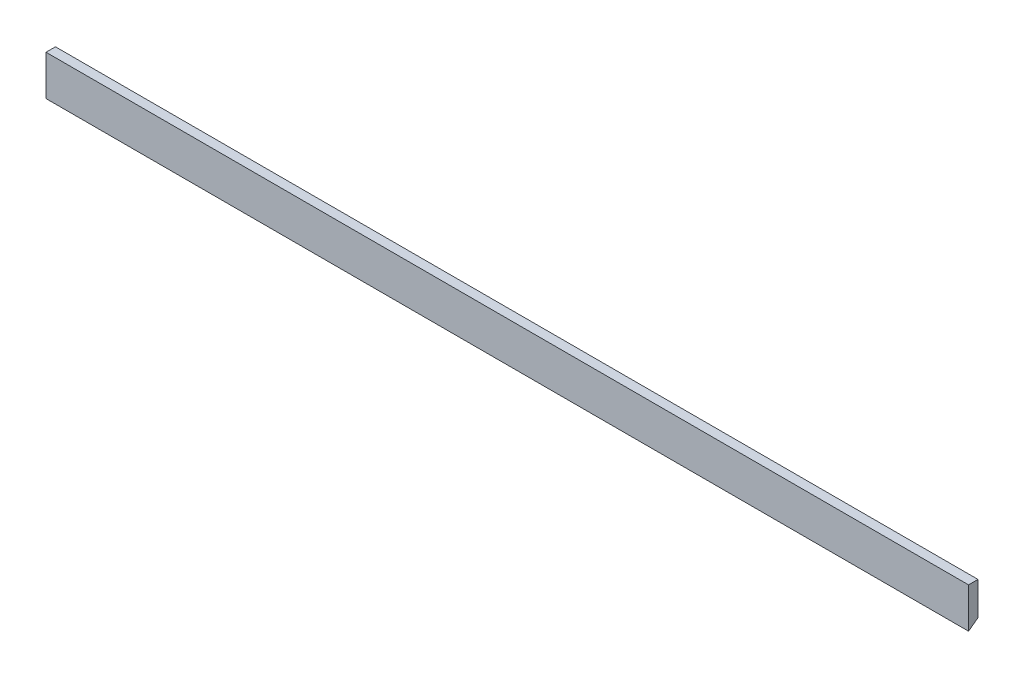
ISO-10303-21;
HEADER;
FILE_DESCRIPTION(('STEP AP214'),'2;1');
FILE_NAME('part.step','',(''),(''),'','','');
FILE_SCHEMA(('AUTOMOTIVE_DESIGN { 1 0 10303 214 1 1 1 1 }'));
ENDSEC;
DATA;
#1=APPLICATION_CONTEXT('core data for automotive mechanical design processes');
#2=APPLICATION_PROTOCOL_DEFINITION('international standard','automotive_design',2000,#1);
#3=PRODUCT_CONTEXT('',#1,'mechanical');
#4=PRODUCT('Part','Part','',(#3));
#5=PRODUCT_RELATED_PRODUCT_CATEGORY('part','',(#4));
#6=PRODUCT_DEFINITION_FORMATION('','',#4);
#7=PRODUCT_DEFINITION_CONTEXT('part definition',#1,'design');
#8=PRODUCT_DEFINITION('design','',#6,#7);
#9=PRODUCT_DEFINITION_SHAPE('','',#8);
#10=(LENGTH_UNIT() NAMED_UNIT(*) SI_UNIT(.MILLI.,.METRE.));
#11=(NAMED_UNIT(*) PLANE_ANGLE_UNIT() SI_UNIT($,.RADIAN.));
#12=(NAMED_UNIT(*) SI_UNIT($,.STERADIAN.) SOLID_ANGLE_UNIT());
#13=UNCERTAINTY_MEASURE_WITH_UNIT(LENGTH_MEASURE(1.E-05),#10,'distance_accuracy_value','');
#14=(GEOMETRIC_REPRESENTATION_CONTEXT(3) GLOBAL_UNCERTAINTY_ASSIGNED_CONTEXT((#13)) GLOBAL_UNIT_ASSIGNED_CONTEXT((#10,
#11,#12)) REPRESENTATION_CONTEXT('',''));
#15=CARTESIAN_POINT('',(0.,0.,0.));
#16=DIRECTION('',(0.,0.,1.));
#17=DIRECTION('',(1.,0.,0.));
#18=AXIS2_PLACEMENT_3D('',#15,#16,#17);
#19=CARTESIAN_POINT('',(310.,6.745,-1.5875));
#20=DIRECTION('',(0.,0.,1.));
#21=DIRECTION('',(0.,-1.,0.));
#22=AXIS2_PLACEMENT_3D('',#19,#20,#21);
#23=PLANE('',#22);
#24=DIRECTION('',(0.,1.,0.));
#25=VECTOR('',#24,1.);
#26=CARTESIAN_POINT('',(310.,6.745,-1.5875));
#27=LINE('',#26,#25);
#28=CARTESIAN_POINT('',(310.,-4.39562358678452,-1.5875));
#29=VERTEX_POINT('',#28);
#30=CARTESIAN_POINT('',(310.,6.745,-1.5875));
#31=VERTEX_POINT('',#30);
#32=EDGE_CURVE('E77',#29,#31,#27,.T.);
#33=ORIENTED_EDGE('',*,*,#32,.F.);
#34=DIRECTION('',(-1.,0.,0.));
#35=VECTOR('',#34,1.);
#36=CARTESIAN_POINT('',(310.,-4.39562358678452,-1.5875));
#37=LINE('',#36,#35);
#38=CARTESIAN_POINT('',(0.,-4.39562358678452,-1.5875));
#39=VERTEX_POINT('',#38);
#40=EDGE_CURVE('E97',#29,#39,#37,.T.);
#41=ORIENTED_EDGE('',*,*,#40,.T.);
#42=DIRECTION('',(0.,1.,0.));
#43=VECTOR('',#42,1.);
#44=CARTESIAN_POINT('',(0.,6.745,-1.5875));
#45=LINE('',#44,#43);
#46=CARTESIAN_POINT('',(0.,6.745,-1.5875));
#47=VERTEX_POINT('',#46);
#48=EDGE_CURVE('E100',#39,#47,#45,.T.);
#49=ORIENTED_EDGE('',*,*,#48,.T.);
#50=DIRECTION('',(-1.,0.,0.));
#51=VECTOR('',#50,1.);
#52=CARTESIAN_POINT('',(310.,6.745,-1.5875));
#53=LINE('',#52,#51);
#54=EDGE_CURVE('E89',#31,#47,#53,.T.);
#55=ORIENTED_EDGE('',*,*,#54,.F.);
#56=EDGE_LOOP('',(#33,#41,#49,#55));
#57=FACE_BOUND('',#56,.T.);
#58=ADVANCED_FACE('F41',(#57),#23,.F.);
#59=CARTESIAN_POINT('',(310.,6.745,1.5875));
#60=DIRECTION('',(0.,-1.,0.));
#61=DIRECTION('',(0.,0.,-1.));
#62=AXIS2_PLACEMENT_3D('',#59,#60,#61);
#63=PLANE('',#62);
#64=DIRECTION('',(0.,0.,1.));
#65=VECTOR('',#64,1.);
#66=CARTESIAN_POINT('',(0.,6.745,1.5875));
#67=LINE('',#66,#65);
#68=CARTESIAN_POINT('',(0.,6.745,1.5875));
#69=VERTEX_POINT('',#68);
#70=EDGE_CURVE('E115',#47,#69,#67,.T.);
#71=ORIENTED_EDGE('',*,*,#70,.T.);
#72=DIRECTION('',(-1.,0.,0.));
#73=VECTOR('',#72,1.);
#74=CARTESIAN_POINT('',(310.,6.745,1.5875));
#75=LINE('',#74,#73);
#76=CARTESIAN_POINT('',(310.,6.745,1.5875));
#77=VERTEX_POINT('',#76);
#78=EDGE_CURVE('E95',#77,#69,#75,.T.);
#79=ORIENTED_EDGE('',*,*,#78,.F.);
#80=DIRECTION('',(0.,0.,1.));
#81=VECTOR('',#80,1.);
#82=CARTESIAN_POINT('',(310.,6.745,1.5875));
#83=LINE('',#82,#81);
#84=EDGE_CURVE('E82',#31,#77,#83,.T.);
#85=ORIENTED_EDGE('',*,*,#84,.F.);
#86=ORIENTED_EDGE('',*,*,#54,.T.);
#87=EDGE_LOOP('',(#71,#79,#85,#86));
#88=FACE_BOUND('',#87,.T.);
#89=ADVANCED_FACE('F90',(#88),#63,.F.);
#90=CARTESIAN_POINT('',(310.,6.745,1.5875));
#91=DIRECTION('',(0.,0.,-1.));
#92=DIRECTION('',(0.,1.,0.));
#93=AXIS2_PLACEMENT_3D('',#90,#91,#92);
#94=PLANE('',#93);
#95=DIRECTION('',(0.,-1.,0.));
#96=VECTOR('',#95,1.);
#97=CARTESIAN_POINT('',(0.,6.745,1.5875));
#98=LINE('',#97,#96);
#99=CARTESIAN_POINT('',(0.,-6.745,1.5875));
#100=VERTEX_POINT('',#99);
#101=EDGE_CURVE('E83',#69,#100,#98,.T.);
#102=ORIENTED_EDGE('',*,*,#101,.T.);
#103=DIRECTION('',(-1.,0.,0.));
#104=VECTOR('',#103,1.);
#105=CARTESIAN_POINT('',(310.,-6.745,1.5875));
#106=LINE('',#105,#104);
#107=CARTESIAN_POINT('',(310.,-6.745,1.5875));
#108=VERTEX_POINT('',#107);
#109=EDGE_CURVE('E105',#108,#100,#106,.T.);
#110=ORIENTED_EDGE('',*,*,#109,.F.);
#111=DIRECTION('',(0.,-1.,0.));
#112=VECTOR('',#111,1.);
#113=CARTESIAN_POINT('',(310.,6.745,1.5875));
#114=LINE('',#113,#112);
#115=EDGE_CURVE('E94',#77,#108,#114,.T.);
#116=ORIENTED_EDGE('',*,*,#115,.F.);
#117=ORIENTED_EDGE('',*,*,#78,.T.);
#118=EDGE_LOOP('',(#102,#110,#116,#117));
#119=FACE_BOUND('',#118,.T.);
#120=ADVANCED_FACE('F112',(#119),#94,.F.);
#121=CARTESIAN_POINT('',(310.,0.,0.));
#122=DIRECTION('',(1.,0.,0.));
#123=DIRECTION('',(0.,0.,-1.));
#124=AXIS2_PLACEMENT_3D('',#121,#122,#123);
#125=PLANE('',#124);
#126=ORIENTED_EDGE('',*,*,#115,.T.);
#127=DIRECTION('',(0.,-0.594822786751341,0.803856860617218));
#128=VECTOR('',#127,1.);
#129=CARTESIAN_POINT('',(310.,-3.59945667413175,-2.663457830109));
#130=LINE('',#129,#128);
#131=EDGE_CURVE('E11',#108,#29,#130,.F.);
#132=ORIENTED_EDGE('',*,*,#131,.T.);
#133=ORIENTED_EDGE('',*,*,#32,.T.);
#134=ORIENTED_EDGE('',*,*,#84,.T.);
#135=EDGE_LOOP('',(#126,#132,#133,#134));
#136=FACE_BOUND('',#135,.T.);
#137=ADVANCED_FACE('F76',(#136),#125,.T.);
#138=CARTESIAN_POINT('',(0.,0.,0.));
#139=DIRECTION('',(1.,0.,0.));
#140=DIRECTION('',(0.,0.,-1.));
#141=AXIS2_PLACEMENT_3D('',#138,#139,#140);
#142=PLANE('',#141);
#143=ORIENTED_EDGE('',*,*,#48,.F.);
#144=DIRECTION('',(0.,0.594822786751341,-0.803856860617218));
#145=VECTOR('',#144,1.);
#146=CARTESIAN_POINT('',(0.,-4.39562358678452,-1.5875));
#147=LINE('',#146,#145);
#148=EDGE_CURVE('E49',#39,#100,#147,.F.);
#149=ORIENTED_EDGE('',*,*,#148,.T.);
#150=ORIENTED_EDGE('',*,*,#101,.F.);
#151=ORIENTED_EDGE('',*,*,#70,.F.);
#152=EDGE_LOOP('',(#143,#149,#150,#151));
#153=FACE_BOUND('',#152,.T.);
#154=ADVANCED_FACE('F107',(#153),#142,.F.);
#155=CARTESIAN_POINT('',(310.,-4.39562358678452,-1.5875));
#156=DIRECTION('',(0.,0.803856860617218,0.594822786751341));
#157=DIRECTION('',(-1.,0.,0.));
#158=AXIS2_PLACEMENT_3D('',#155,#156,#157);
#159=PLANE('',#158);
#160=ORIENTED_EDGE('',*,*,#131,.F.);
#161=ORIENTED_EDGE('',*,*,#109,.T.);
#162=ORIENTED_EDGE('',*,*,#148,.F.);
#163=ORIENTED_EDGE('',*,*,#40,.F.);
#164=EDGE_LOOP('',(#160,#161,#162,#163));
#165=FACE_BOUND('',#164,.T.);
#166=ADVANCED_FACE('F42',(#165),#159,.F.);
#167=CLOSED_SHELL('',(#58,#89,#120,#137,#154,#166));
#168=MANIFOLD_SOLID_BREP('B2',#167);
#169=ADVANCED_BREP_SHAPE_REPRESENTATION('',(#18,#168),#14);
#170=SHAPE_DEFINITION_REPRESENTATION(#9,#169);
ENDSEC;
END-ISO-10303-21;
